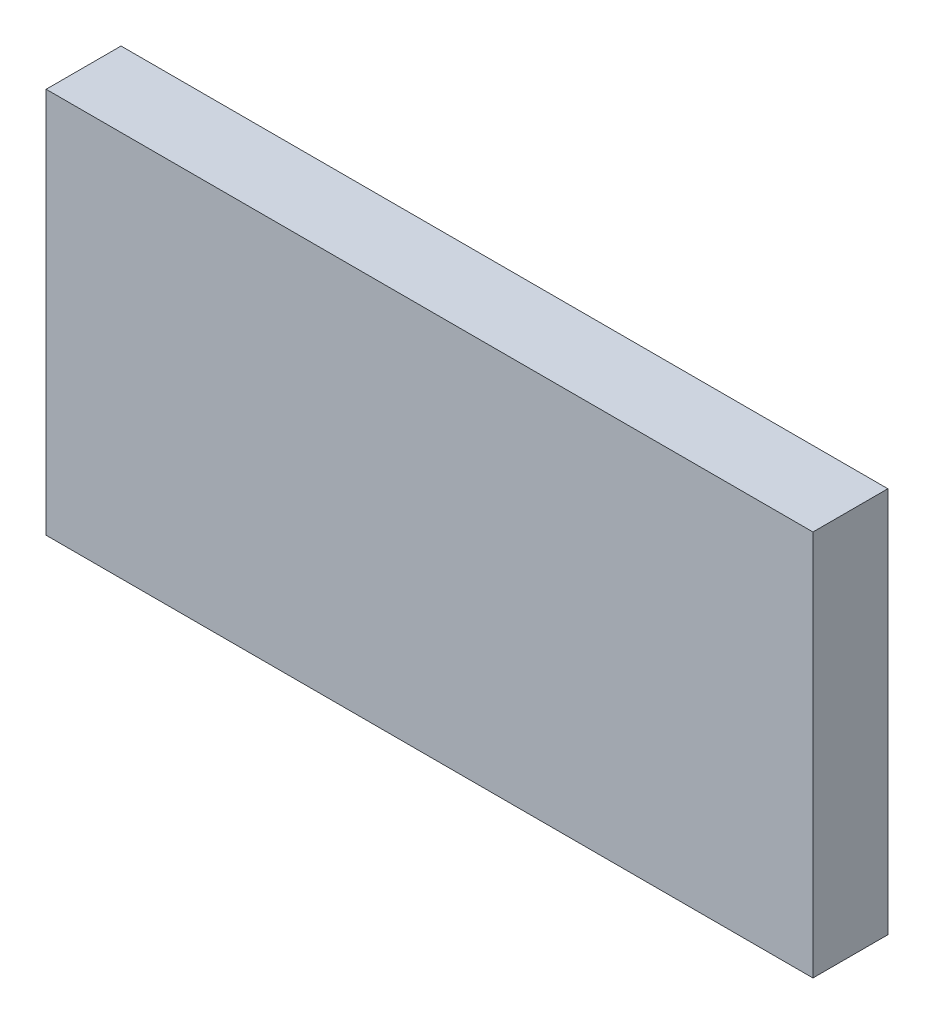
ISO-10303-21;
HEADER;
FILE_DESCRIPTION(('STEP AP214'),'2;1');
FILE_NAME('part.step','',(''),(''),'','','');
FILE_SCHEMA(('AUTOMOTIVE_DESIGN { 1 0 10303 214 1 1 1 1 }'));
ENDSEC;
DATA;
#1=APPLICATION_CONTEXT('core data for automotive mechanical design processes');
#2=APPLICATION_PROTOCOL_DEFINITION('international standard','automotive_design',2000,#1);
#3=PRODUCT_CONTEXT('',#1,'mechanical');
#4=PRODUCT('Part','Part','',(#3));
#5=PRODUCT_RELATED_PRODUCT_CATEGORY('part','',(#4));
#6=PRODUCT_DEFINITION_FORMATION('','',#4);
#7=PRODUCT_DEFINITION_CONTEXT('part definition',#1,'design');
#8=PRODUCT_DEFINITION('design','',#6,#7);
#9=PRODUCT_DEFINITION_SHAPE('','',#8);
#10=(LENGTH_UNIT() NAMED_UNIT(*) SI_UNIT(.MILLI.,.METRE.));
#11=(NAMED_UNIT(*) PLANE_ANGLE_UNIT() SI_UNIT($,.RADIAN.));
#12=(NAMED_UNIT(*) SI_UNIT($,.STERADIAN.) SOLID_ANGLE_UNIT());
#13=UNCERTAINTY_MEASURE_WITH_UNIT(LENGTH_MEASURE(1.E-05),#10,'distance_accuracy_value','');
#14=(GEOMETRIC_REPRESENTATION_CONTEXT(3) GLOBAL_UNCERTAINTY_ASSIGNED_CONTEXT((#13)) GLOBAL_UNIT_ASSIGNED_CONTEXT((#10,
#11,#12)) REPRESENTATION_CONTEXT('',''));
#15=CARTESIAN_POINT('',(0.,0.,0.));
#16=DIRECTION('',(0.,0.,1.));
#17=DIRECTION('',(1.,0.,0.));
#18=AXIS2_PLACEMENT_3D('',#15,#16,#17);
#19=CARTESIAN_POINT('',(-5.1562,-2.6162,1.));
#20=DIRECTION('',(1.,0.,0.));
#21=DIRECTION('',(0.,0.,-1.));
#22=AXIS2_PLACEMENT_3D('',#19,#20,#21);
#23=PLANE('',#22);
#24=DIRECTION('',(0.,-1.,0.));
#25=VECTOR('',#24,1.);
#26=CARTESIAN_POINT('',(-5.1562,-2.6162,0.));
#27=LINE('',#26,#25);
#28=CARTESIAN_POINT('',(-5.1562,2.54,0.));
#29=VERTEX_POINT('',#28);
#30=CARTESIAN_POINT('',(-5.1562,-2.6162,0.));
#31=VERTEX_POINT('',#30);
#32=EDGE_CURVE('E95',#29,#31,#27,.T.);
#33=ORIENTED_EDGE('',*,*,#32,.T.);
#34=DIRECTION('',(0.,0.,-1.));
#35=VECTOR('',#34,1.);
#36=CARTESIAN_POINT('',(-5.1562,-2.6162,1.));
#37=LINE('',#36,#35);
#38=CARTESIAN_POINT('',(-5.1562,-2.6162,1.));
#39=VERTEX_POINT('',#38);
#40=EDGE_CURVE('E11',#39,#31,#37,.T.);
#41=ORIENTED_EDGE('',*,*,#40,.F.);
#42=DIRECTION('',(0.,-1.,0.));
#43=VECTOR('',#42,1.);
#44=CARTESIAN_POINT('',(-5.1562,-2.6162,1.));
#45=LINE('',#44,#43);
#46=CARTESIAN_POINT('',(-5.1562,2.54,1.));
#47=VERTEX_POINT('',#46);
#48=EDGE_CURVE('E83',#47,#39,#45,.T.);
#49=ORIENTED_EDGE('',*,*,#48,.F.);
#50=DIRECTION('',(0.,0.,-1.));
#51=VECTOR('',#50,1.);
#52=CARTESIAN_POINT('',(-5.1562,2.54,1.));
#53=LINE('',#52,#51);
#54=EDGE_CURVE('E91',#47,#29,#53,.T.);
#55=ORIENTED_EDGE('',*,*,#54,.T.);
#56=EDGE_LOOP('',(#33,#41,#49,#55));
#57=FACE_BOUND('',#56,.T.);
#58=ADVANCED_FACE('F32',(#57),#23,.F.);
#59=CARTESIAN_POINT('',(5.08,-2.6162,1.));
#60=DIRECTION('',(0.,1.,0.));
#61=DIRECTION('',(0.,0.,1.));
#62=AXIS2_PLACEMENT_3D('',#59,#60,#61);
#63=PLANE('',#62);
#64=DIRECTION('',(1.,0.,0.));
#65=VECTOR('',#64,1.);
#66=CARTESIAN_POINT('',(5.08,-2.6162,0.));
#67=LINE('',#66,#65);
#68=CARTESIAN_POINT('',(5.08,-2.6162,0.));
#69=VERTEX_POINT('',#68);
#70=EDGE_CURVE('E87',#31,#69,#67,.T.);
#71=ORIENTED_EDGE('',*,*,#70,.T.);
#72=DIRECTION('',(0.,0.,-1.));
#73=VECTOR('',#72,1.);
#74=CARTESIAN_POINT('',(5.08,-2.6162,1.));
#75=LINE('',#74,#73);
#76=CARTESIAN_POINT('',(5.08,-2.6162,1.));
#77=VERTEX_POINT('',#76);
#78=EDGE_CURVE('E40',#77,#69,#75,.T.);
#79=ORIENTED_EDGE('',*,*,#78,.F.);
#80=DIRECTION('',(1.,0.,0.));
#81=VECTOR('',#80,1.);
#82=CARTESIAN_POINT('',(5.08,-2.6162,1.));
#83=LINE('',#82,#81);
#84=EDGE_CURVE('E78',#39,#77,#83,.T.);
#85=ORIENTED_EDGE('',*,*,#84,.F.);
#86=ORIENTED_EDGE('',*,*,#40,.T.);
#87=EDGE_LOOP('',(#71,#79,#85,#86));
#88=FACE_BOUND('',#87,.T.);
#89=ADVANCED_FACE('F86',(#88),#63,.F.);
#90=CARTESIAN_POINT('',(5.08,2.54,1.));
#91=DIRECTION('',(-1.,0.,0.));
#92=DIRECTION('',(0.,0.,1.));
#93=AXIS2_PLACEMENT_3D('',#90,#91,#92);
#94=PLANE('',#93);
#95=DIRECTION('',(0.,1.,0.));
#96=VECTOR('',#95,1.);
#97=CARTESIAN_POINT('',(5.08,2.54,0.));
#98=LINE('',#97,#96);
#99=CARTESIAN_POINT('',(5.08,2.54,0.));
#100=VERTEX_POINT('',#99);
#101=EDGE_CURVE('E65',#69,#100,#98,.T.);
#102=ORIENTED_EDGE('',*,*,#101,.T.);
#103=DIRECTION('',(0.,0.,-1.));
#104=VECTOR('',#103,1.);
#105=CARTESIAN_POINT('',(5.08,2.54,1.));
#106=LINE('',#105,#104);
#107=CARTESIAN_POINT('',(5.08,2.54,1.));
#108=VERTEX_POINT('',#107);
#109=EDGE_CURVE('E88',#108,#100,#106,.T.);
#110=ORIENTED_EDGE('',*,*,#109,.F.);
#111=DIRECTION('',(0.,1.,0.));
#112=VECTOR('',#111,1.);
#113=CARTESIAN_POINT('',(5.08,2.54,1.));
#114=LINE('',#113,#112);
#115=EDGE_CURVE('E81',#77,#108,#114,.T.);
#116=ORIENTED_EDGE('',*,*,#115,.F.);
#117=ORIENTED_EDGE('',*,*,#78,.T.);
#118=EDGE_LOOP('',(#102,#110,#116,#117));
#119=FACE_BOUND('',#118,.T.);
#120=ADVANCED_FACE('F89',(#119),#94,.F.);
#121=CARTESIAN_POINT('',(-5.1562,2.54,1.));
#122=DIRECTION('',(0.,-1.,0.));
#123=DIRECTION('',(0.,0.,-1.));
#124=AXIS2_PLACEMENT_3D('',#121,#122,#123);
#125=PLANE('',#124);
#126=DIRECTION('',(-1.,0.,0.));
#127=VECTOR('',#126,1.);
#128=CARTESIAN_POINT('',(-5.1562,2.54,0.));
#129=LINE('',#128,#127);
#130=EDGE_CURVE('E71',#100,#29,#129,.T.);
#131=ORIENTED_EDGE('',*,*,#130,.T.);
#132=ORIENTED_EDGE('',*,*,#54,.F.);
#133=DIRECTION('',(-1.,0.,0.));
#134=VECTOR('',#133,1.);
#135=CARTESIAN_POINT('',(-5.1562,2.54,1.));
#136=LINE('',#135,#134);
#137=EDGE_CURVE('E48',#108,#47,#136,.T.);
#138=ORIENTED_EDGE('',*,*,#137,.F.);
#139=ORIENTED_EDGE('',*,*,#109,.T.);
#140=EDGE_LOOP('',(#131,#132,#138,#139));
#141=FACE_BOUND('',#140,.T.);
#142=ADVANCED_FACE('F102',(#141),#125,.F.);
#143=CARTESIAN_POINT('',(0.,0.,1.));
#144=DIRECTION('',(0.,0.,-1.));
#145=DIRECTION('',(-1.,0.,0.));
#146=AXIS2_PLACEMENT_3D('',#143,#144,#145);
#147=PLANE('',#146);
#148=ORIENTED_EDGE('',*,*,#48,.T.);
#149=ORIENTED_EDGE('',*,*,#84,.T.);
#150=ORIENTED_EDGE('',*,*,#115,.T.);
#151=ORIENTED_EDGE('',*,*,#137,.T.);
#152=EDGE_LOOP('',(#148,#149,#150,#151));
#153=FACE_BOUND('',#152,.T.);
#154=ADVANCED_FACE('F79',(#153),#147,.F.);
#155=CARTESIAN_POINT('',(0.,0.,0.));
#156=DIRECTION('',(0.,0.,-1.));
#157=DIRECTION('',(-1.,0.,0.));
#158=AXIS2_PLACEMENT_3D('',#155,#156,#157);
#159=PLANE('',#158);
#160=ORIENTED_EDGE('',*,*,#32,.F.);
#161=ORIENTED_EDGE('',*,*,#130,.F.);
#162=ORIENTED_EDGE('',*,*,#101,.F.);
#163=ORIENTED_EDGE('',*,*,#70,.F.);
#164=EDGE_LOOP('',(#160,#161,#162,#163));
#165=FACE_BOUND('',#164,.T.);
#166=ADVANCED_FACE('F105',(#165),#159,.T.);
#167=CLOSED_SHELL('',(#58,#89,#120,#142,#154,#166));
#168=MANIFOLD_SOLID_BREP('B2',#167);
#169=ADVANCED_BREP_SHAPE_REPRESENTATION('',(#18,#168),#14);
#170=SHAPE_DEFINITION_REPRESENTATION(#9,#169);
ENDSEC;
END-ISO-10303-21;
